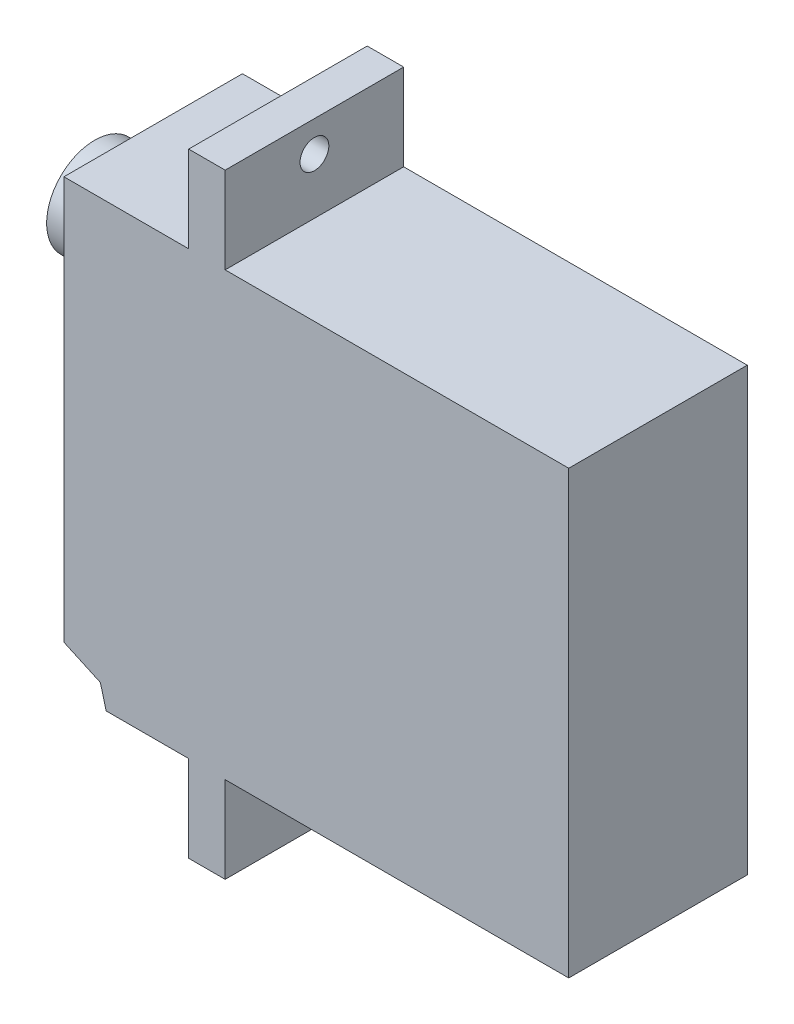
ISO-10303-21;
HEADER;
FILE_DESCRIPTION(('STEP AP214'),'2;1');
FILE_NAME('part.step','',(''),(''),'','','');
FILE_SCHEMA(('AUTOMOTIVE_DESIGN { 1 0 10303 214 1 1 1 1 }'));
ENDSEC;
DATA;
#1=APPLICATION_CONTEXT('core data for automotive mechanical design processes');
#2=APPLICATION_PROTOCOL_DEFINITION('international standard','automotive_design',2000,#1);
#3=PRODUCT_CONTEXT('',#1,'mechanical');
#4=PRODUCT('Part','Part','',(#3));
#5=PRODUCT_RELATED_PRODUCT_CATEGORY('part','',(#4));
#6=PRODUCT_DEFINITION_FORMATION('','',#4);
#7=PRODUCT_DEFINITION_CONTEXT('part definition',#1,'design');
#8=PRODUCT_DEFINITION('design','',#6,#7);
#9=PRODUCT_DEFINITION_SHAPE('','',#8);
#10=(LENGTH_UNIT() NAMED_UNIT(*) SI_UNIT(.MILLI.,.METRE.));
#11=(NAMED_UNIT(*) PLANE_ANGLE_UNIT() SI_UNIT($,.RADIAN.));
#12=(NAMED_UNIT(*) SI_UNIT($,.STERADIAN.) SOLID_ANGLE_UNIT());
#13=UNCERTAINTY_MEASURE_WITH_UNIT(LENGTH_MEASURE(1.E-05),#10,'distance_accuracy_value','');
#14=(GEOMETRIC_REPRESENTATION_CONTEXT(3) GLOBAL_UNCERTAINTY_ASSIGNED_CONTEXT((#13)) GLOBAL_UNIT_ASSIGNED_CONTEXT((#10,
#11,#12)) REPRESENTATION_CONTEXT('',''));
#15=CARTESIAN_POINT('',(0.,0.,0.));
#16=DIRECTION('',(0.,0.,1.));
#17=DIRECTION('',(1.,0.,0.));
#18=AXIS2_PLACEMENT_3D('',#15,#16,#17);
#19=CARTESIAN_POINT('',(-4.75000000000001,11.5,4.65));
#20=DIRECTION('',(0.,-1.,0.));
#21=DIRECTION('',(1.,0.,0.));
#22=AXIS2_PLACEMENT_3D('',#19,#20,#21);
#23=PLANE('',#22);
#24=DIRECTION('',(-1.,0.,0.));
#25=VECTOR('',#24,1.);
#26=CARTESIAN_POINT('',(-4.75000000000001,11.5,-4.65));
#27=LINE('',#26,#25);
#28=CARTESIAN_POINT('',(13.15,11.5,-4.65));
#29=VERTEX_POINT('',#28);
#30=CARTESIAN_POINT('',(-4.75000000000001,11.5,-4.65));
#31=VERTEX_POINT('',#30);
#32=EDGE_CURVE('E166',#29,#31,#27,.T.);
#33=ORIENTED_EDGE('',*,*,#32,.T.);
#34=DIRECTION('',(0.,0.,-1.));
#35=VECTOR('',#34,1.);
#36=CARTESIAN_POINT('',(-4.75000000000001,11.5,4.65));
#37=LINE('',#36,#35);
#38=CARTESIAN_POINT('',(-4.75000000000001,11.5,4.65));
#39=VERTEX_POINT('',#38);
#40=EDGE_CURVE('E11',#39,#31,#37,.T.);
#41=ORIENTED_EDGE('',*,*,#40,.F.);
#42=DIRECTION('',(-1.,0.,0.));
#43=VECTOR('',#42,1.);
#44=CARTESIAN_POINT('',(-4.75000000000001,11.5,4.65));
#45=LINE('',#44,#43);
#46=CARTESIAN_POINT('',(13.15,11.5,4.65));
#47=VERTEX_POINT('',#46);
#48=EDGE_CURVE('E192',#47,#39,#45,.T.);
#49=ORIENTED_EDGE('',*,*,#48,.F.);
#50=DIRECTION('',(0.,0.,-1.));
#51=VECTOR('',#50,1.);
#52=CARTESIAN_POINT('',(13.15,11.5,4.65));
#53=LINE('',#52,#51);
#54=EDGE_CURVE('E162',#47,#29,#53,.T.);
#55=ORIENTED_EDGE('',*,*,#54,.T.);
#56=EDGE_LOOP('',(#33,#41,#49,#55));
#57=FACE_BOUND('',#56,.T.);
#58=ADVANCED_FACE('F39',(#57),#23,.F.);
#59=CARTESIAN_POINT('',(-4.75000000000001,11.5,4.65));
#60=DIRECTION('',(-1.,0.,0.));
#61=DIRECTION('',(0.,0.,1.));
#62=AXIS2_PLACEMENT_3D('',#59,#60,#61);
#63=PLANE('',#62);
#64=CARTESIAN_POINT('',(-4.75000000000001,14.4,0.));
#65=DIRECTION('',(-1.,0.,0.));
#66=DIRECTION('',(0.,0.,1.));
#67=AXIS2_PLACEMENT_3D('',#64,#65,#66);
#68=CIRCLE('',#67,0.750000000000001);
#69=CARTESIAN_POINT('',(-4.75000000000001,14.4,0.750000000000001));
#70=VERTEX_POINT('',#69);
#71=EDGE_CURVE('E284',#70,#70,#68,.T.);
#72=ORIENTED_EDGE('',*,*,#71,.T.);
#73=EDGE_LOOP('',(#72));
#74=FACE_BOUND('',#73,.T.);
#75=DIRECTION('',(0.,1.,0.));
#76=VECTOR('',#75,1.);
#77=CARTESIAN_POINT('',(-4.75000000000001,11.5,-4.65));
#78=LINE('',#77,#76);
#79=CARTESIAN_POINT('',(-4.75000000000001,16.,-4.65));
#80=VERTEX_POINT('',#79);
#81=EDGE_CURVE('E169',#31,#80,#78,.T.);
#82=ORIENTED_EDGE('',*,*,#81,.T.);
#83=DIRECTION('',(0.,0.,-1.));
#84=VECTOR('',#83,1.);
#85=CARTESIAN_POINT('',(-4.75000000000001,16.,4.65));
#86=LINE('',#85,#84);
#87=CARTESIAN_POINT('',(-4.75000000000001,16.,4.65));
#88=VERTEX_POINT('',#87);
#89=EDGE_CURVE('E47',#88,#80,#86,.T.);
#90=ORIENTED_EDGE('',*,*,#89,.F.);
#91=DIRECTION('',(0.,1.,0.));
#92=VECTOR('',#91,1.);
#93=CARTESIAN_POINT('',(-4.75000000000001,11.5,4.65));
#94=LINE('',#93,#92);
#95=EDGE_CURVE('E113',#39,#88,#94,.T.);
#96=ORIENTED_EDGE('',*,*,#95,.F.);
#97=ORIENTED_EDGE('',*,*,#40,.T.);
#98=EDGE_LOOP('',(#82,#90,#96,#97));
#99=FACE_BOUND('',#98,.T.);
#100=ADVANCED_FACE('F314',(#74,#99),#63,.F.);
#101=CARTESIAN_POINT('',(-4.75000000000001,16.,4.65));
#102=DIRECTION('',(0.,-1.,0.));
#103=DIRECTION('',(1.,0.,0.));
#104=AXIS2_PLACEMENT_3D('',#101,#102,#103);
#105=PLANE('',#104);
#106=DIRECTION('',(-1.,0.,0.));
#107=VECTOR('',#106,1.);
#108=CARTESIAN_POINT('',(-4.75000000000001,16.,-4.65));
#109=LINE('',#108,#107);
#110=CARTESIAN_POINT('',(-6.65,16.,-4.65));
#111=VERTEX_POINT('',#110);
#112=EDGE_CURVE('E172',#80,#111,#109,.T.);
#113=ORIENTED_EDGE('',*,*,#112,.T.);
#114=DIRECTION('',(0.,0.,-1.));
#115=VECTOR('',#114,1.);
#116=CARTESIAN_POINT('',(-6.65,16.,4.65));
#117=LINE('',#116,#115);
#118=CARTESIAN_POINT('',(-6.65,16.,4.65));
#119=VERTEX_POINT('',#118);
#120=EDGE_CURVE('E208',#119,#111,#117,.T.);
#121=ORIENTED_EDGE('',*,*,#120,.F.);
#122=DIRECTION('',(-1.,0.,0.));
#123=VECTOR('',#122,1.);
#124=CARTESIAN_POINT('',(-4.75000000000001,16.,4.65));
#125=LINE('',#124,#123);
#126=EDGE_CURVE('E217',#88,#119,#125,.T.);
#127=ORIENTED_EDGE('',*,*,#126,.F.);
#128=ORIENTED_EDGE('',*,*,#89,.T.);
#129=EDGE_LOOP('',(#113,#121,#127,#128));
#130=FACE_BOUND('',#129,.T.);
#131=ADVANCED_FACE('F215',(#130),#105,.F.);
#132=CARTESIAN_POINT('',(-6.65,16.,4.65));
#133=DIRECTION('',(1.,0.,0.));
#134=DIRECTION('',(0.,1.,0.));
#135=AXIS2_PLACEMENT_3D('',#132,#133,#134);
#136=PLANE('',#135);
#137=CARTESIAN_POINT('',(-6.65,14.4,0.));
#138=DIRECTION('',(-1.,0.,0.));
#139=DIRECTION('',(0.,-1.,0.));
#140=AXIS2_PLACEMENT_3D('',#137,#138,#139);
#141=CIRCLE('',#140,0.750000000000001);
#142=CARTESIAN_POINT('',(-6.65,13.65,0.));
#143=VERTEX_POINT('',#142);
#144=EDGE_CURVE('E290',#143,#143,#141,.T.);
#145=ORIENTED_EDGE('',*,*,#144,.F.);
#146=EDGE_LOOP('',(#145));
#147=FACE_BOUND('',#146,.T.);
#148=DIRECTION('',(0.,-1.,0.));
#149=VECTOR('',#148,1.);
#150=CARTESIAN_POINT('',(-6.65,16.,-4.65));
#151=LINE('',#150,#149);
#152=CARTESIAN_POINT('',(-6.65,11.5,-4.65));
#153=VERTEX_POINT('',#152);
#154=EDGE_CURVE('E174',#111,#153,#151,.T.);
#155=ORIENTED_EDGE('',*,*,#154,.T.);
#156=DIRECTION('',(0.,0.,-1.));
#157=VECTOR('',#156,1.);
#158=CARTESIAN_POINT('',(-6.65,11.5,4.65));
#159=LINE('',#158,#157);
#160=CARTESIAN_POINT('',(-6.65,11.5,4.65));
#161=VERTEX_POINT('',#160);
#162=EDGE_CURVE('E205',#161,#153,#159,.T.);
#163=ORIENTED_EDGE('',*,*,#162,.F.);
#164=DIRECTION('',(0.,-1.,0.));
#165=VECTOR('',#164,1.);
#166=CARTESIAN_POINT('',(-6.65,16.,4.65));
#167=LINE('',#166,#165);
#168=EDGE_CURVE('E236',#119,#161,#167,.T.);
#169=ORIENTED_EDGE('',*,*,#168,.F.);
#170=ORIENTED_EDGE('',*,*,#120,.T.);
#171=EDGE_LOOP('',(#155,#163,#169,#170));
#172=FACE_BOUND('',#171,.T.);
#173=ADVANCED_FACE('F226',(#147,#172),#136,.F.);
#174=CARTESIAN_POINT('',(-13.15,11.5,4.65));
#175=DIRECTION('',(0.,-1.,0.));
#176=DIRECTION('',(0.,0.,-1.));
#177=AXIS2_PLACEMENT_3D('',#174,#175,#176);
#178=PLANE('',#177);
#179=DIRECTION('',(-1.,0.,0.));
#180=VECTOR('',#179,1.);
#181=CARTESIAN_POINT('',(-13.15,11.5,-4.65));
#182=LINE('',#181,#180);
#183=CARTESIAN_POINT('',(-13.15,11.5,-4.65));
#184=VERTEX_POINT('',#183);
#185=EDGE_CURVE('E176',#153,#184,#182,.T.);
#186=ORIENTED_EDGE('',*,*,#185,.T.);
#187=DIRECTION('',(0.,0.,-1.));
#188=VECTOR('',#187,1.);
#189=CARTESIAN_POINT('',(-13.15,11.5,4.65));
#190=LINE('',#189,#188);
#191=CARTESIAN_POINT('',(-13.15,11.5,4.65));
#192=VERTEX_POINT('',#191);
#193=EDGE_CURVE('E202',#192,#184,#190,.T.);
#194=ORIENTED_EDGE('',*,*,#193,.F.);
#195=DIRECTION('',(-1.,0.,0.));
#196=VECTOR('',#195,1.);
#197=CARTESIAN_POINT('',(-13.15,11.5,4.65));
#198=LINE('',#197,#196);
#199=EDGE_CURVE('E232',#161,#192,#198,.T.);
#200=ORIENTED_EDGE('',*,*,#199,.F.);
#201=ORIENTED_EDGE('',*,*,#162,.T.);
#202=EDGE_LOOP('',(#186,#194,#200,#201));
#203=FACE_BOUND('',#202,.T.);
#204=ADVANCED_FACE('F230',(#203),#178,.F.);
#205=CARTESIAN_POINT('',(-13.15,-11.5,4.65));
#206=DIRECTION('',(1.,0.,0.));
#207=DIRECTION('',(0.,0.,-1.));
#208=AXIS2_PLACEMENT_3D('',#205,#206,#207);
#209=PLANE('',#208);
#210=CARTESIAN_POINT('',(-13.15,6.8,0.));
#211=DIRECTION('',(1.,0.,0.));
#212=DIRECTION('',(0.,0.,-1.));
#213=AXIS2_PLACEMENT_3D('',#210,#211,#212);
#214=CIRCLE('',#213,2.5);
#215=CARTESIAN_POINT('',(-13.15,6.8,-2.5));
#216=VERTEX_POINT('',#215);
#217=EDGE_CURVE('E281',#216,#216,#214,.T.);
#218=ORIENTED_EDGE('',*,*,#217,.T.);
#219=EDGE_LOOP('',(#218));
#220=FACE_BOUND('',#219,.T.);
#221=DIRECTION('',(0.,-1.,0.));
#222=VECTOR('',#221,1.);
#223=CARTESIAN_POINT('',(-13.15,-11.5,-4.65));
#224=LINE('',#223,#222);
#225=CARTESIAN_POINT('',(-13.15,-9.5,-4.65));
#226=VERTEX_POINT('',#225);
#227=EDGE_CURVE('E179',#184,#226,#224,.T.);
#228=ORIENTED_EDGE('',*,*,#227,.T.);
#229=DIRECTION('',(0.,0.,1.));
#230=VECTOR('',#229,1.);
#231=CARTESIAN_POINT('',(-13.15,-9.5,-4.65));
#232=LINE('',#231,#230);
#233=CARTESIAN_POINT('',(-13.15,-9.5,4.65));
#234=VERTEX_POINT('',#233);
#235=EDGE_CURVE('E54',#226,#234,#232,.T.);
#236=ORIENTED_EDGE('',*,*,#235,.T.);
#237=DIRECTION('',(0.,-1.,0.));
#238=VECTOR('',#237,1.);
#239=CARTESIAN_POINT('',(-13.15,-9.5,4.65));
#240=LINE('',#239,#238);
#241=EDGE_CURVE('E235',#192,#234,#240,.T.);
#242=ORIENTED_EDGE('',*,*,#241,.F.);
#243=ORIENTED_EDGE('',*,*,#193,.T.);
#244=EDGE_LOOP('',(#228,#236,#242,#243));
#245=FACE_BOUND('',#244,.T.);
#246=ADVANCED_FACE('F329',(#220,#245),#209,.F.);
#247=CARTESIAN_POINT('',(-10.95,-11.5,4.65));
#248=DIRECTION('',(0.,1.,0.));
#249=DIRECTION('',(0.,0.,1.));
#250=AXIS2_PLACEMENT_3D('',#247,#248,#249);
#251=PLANE('',#250);
#252=DIRECTION('',(1.,0.,0.));
#253=VECTOR('',#252,1.);
#254=CARTESIAN_POINT('',(-10.95,-11.5,4.65));
#255=LINE('',#254,#253);
#256=CARTESIAN_POINT('',(-10.95,-11.5,4.65));
#257=VERTEX_POINT('',#256);
#258=CARTESIAN_POINT('',(-6.65,-11.5,4.65));
#259=VERTEX_POINT('',#258);
#260=EDGE_CURVE('E238',#257,#259,#255,.T.);
#261=ORIENTED_EDGE('',*,*,#260,.F.);
#262=DIRECTION('',(0.,0.,1.));
#263=VECTOR('',#262,1.);
#264=CARTESIAN_POINT('',(-10.95,-11.5,-4.65));
#265=LINE('',#264,#263);
#266=CARTESIAN_POINT('',(-10.95,-11.5,-4.65));
#267=VERTEX_POINT('',#266);
#268=EDGE_CURVE('E170',#267,#257,#265,.T.);
#269=ORIENTED_EDGE('',*,*,#268,.F.);
#270=DIRECTION('',(1.,0.,0.));
#271=VECTOR('',#270,1.);
#272=CARTESIAN_POINT('',(-10.95,-11.5,-4.65));
#273=LINE('',#272,#271);
#274=CARTESIAN_POINT('',(-6.65,-11.5,-4.65));
#275=VERTEX_POINT('',#274);
#276=EDGE_CURVE('E182',#267,#275,#273,.T.);
#277=ORIENTED_EDGE('',*,*,#276,.T.);
#278=DIRECTION('',(0.,0.,-1.));
#279=VECTOR('',#278,1.);
#280=CARTESIAN_POINT('',(-6.65,-11.5,4.65));
#281=LINE('',#280,#279);
#282=EDGE_CURVE('E199',#259,#275,#281,.T.);
#283=ORIENTED_EDGE('',*,*,#282,.F.);
#284=EDGE_LOOP('',(#261,#269,#277,#283));
#285=FACE_BOUND('',#284,.T.);
#286=ADVANCED_FACE('F332',(#285),#251,.F.);
#287=CARTESIAN_POINT('',(-6.65,-16.,4.65));
#288=DIRECTION('',(1.,0.,0.));
#289=DIRECTION('',(0.,0.,-1.));
#290=AXIS2_PLACEMENT_3D('',#287,#288,#289);
#291=PLANE('',#290);
#292=CARTESIAN_POINT('',(-6.65,-14.4,0.));
#293=DIRECTION('',(-1.,0.,0.));
#294=DIRECTION('',(0.,-1.,0.));
#295=AXIS2_PLACEMENT_3D('',#292,#293,#294);
#296=CIRCLE('',#295,0.750000000000001);
#297=CARTESIAN_POINT('',(-6.65,-15.15,0.));
#298=VERTEX_POINT('',#297);
#299=EDGE_CURVE('E287',#298,#298,#296,.T.);
#300=ORIENTED_EDGE('',*,*,#299,.F.);
#301=EDGE_LOOP('',(#300));
#302=FACE_BOUND('',#301,.T.);
#303=DIRECTION('',(0.,-1.,0.));
#304=VECTOR('',#303,1.);
#305=CARTESIAN_POINT('',(-6.65,-16.,-4.65));
#306=LINE('',#305,#304);
#307=CARTESIAN_POINT('',(-6.65,-16.,-4.65));
#308=VERTEX_POINT('',#307);
#309=EDGE_CURVE('E184',#275,#308,#306,.T.);
#310=ORIENTED_EDGE('',*,*,#309,.T.);
#311=DIRECTION('',(0.,0.,-1.));
#312=VECTOR('',#311,1.);
#313=CARTESIAN_POINT('',(-6.65,-16.,4.65));
#314=LINE('',#313,#312);
#315=CARTESIAN_POINT('',(-6.65,-16.,4.65));
#316=VERTEX_POINT('',#315);
#317=EDGE_CURVE('E196',#316,#308,#314,.T.);
#318=ORIENTED_EDGE('',*,*,#317,.F.);
#319=DIRECTION('',(0.,-1.,0.));
#320=VECTOR('',#319,1.);
#321=CARTESIAN_POINT('',(-6.65,-16.,4.65));
#322=LINE('',#321,#320);
#323=EDGE_CURVE('E244',#259,#316,#322,.T.);
#324=ORIENTED_EDGE('',*,*,#323,.F.);
#325=ORIENTED_EDGE('',*,*,#282,.T.);
#326=EDGE_LOOP('',(#310,#318,#324,#325));
#327=FACE_BOUND('',#326,.T.);
#328=ADVANCED_FACE('F250',(#302,#327),#291,.F.);
#329=CARTESIAN_POINT('',(-4.75000000000001,-16.,4.65));
#330=DIRECTION('',(0.,1.,0.));
#331=DIRECTION('',(-1.,0.,0.));
#332=AXIS2_PLACEMENT_3D('',#329,#330,#331);
#333=PLANE('',#332);
#334=DIRECTION('',(1.,0.,0.));
#335=VECTOR('',#334,1.);
#336=CARTESIAN_POINT('',(-4.75000000000001,-16.,-4.65));
#337=LINE('',#336,#335);
#338=CARTESIAN_POINT('',(-4.75000000000001,-16.,-4.65));
#339=VERTEX_POINT('',#338);
#340=EDGE_CURVE('E186',#308,#339,#337,.T.);
#341=ORIENTED_EDGE('',*,*,#340,.T.);
#342=DIRECTION('',(0.,0.,-1.));
#343=VECTOR('',#342,1.);
#344=CARTESIAN_POINT('',(-4.75000000000001,-16.,4.65));
#345=LINE('',#344,#343);
#346=CARTESIAN_POINT('',(-4.75000000000001,-16.,4.65));
#347=VERTEX_POINT('',#346);
#348=EDGE_CURVE('E157',#347,#339,#345,.T.);
#349=ORIENTED_EDGE('',*,*,#348,.F.);
#350=DIRECTION('',(1.,0.,0.));
#351=VECTOR('',#350,1.);
#352=CARTESIAN_POINT('',(-4.75000000000001,-16.,4.65));
#353=LINE('',#352,#351);
#354=EDGE_CURVE('E145',#316,#347,#353,.T.);
#355=ORIENTED_EDGE('',*,*,#354,.F.);
#356=ORIENTED_EDGE('',*,*,#317,.T.);
#357=EDGE_LOOP('',(#341,#349,#355,#356));
#358=FACE_BOUND('',#357,.T.);
#359=ADVANCED_FACE('F254',(#358),#333,.F.);
#360=CARTESIAN_POINT('',(-4.75000000000001,-11.5,4.65));
#361=DIRECTION('',(-1.,0.,0.));
#362=DIRECTION('',(0.,0.,1.));
#363=AXIS2_PLACEMENT_3D('',#360,#361,#362);
#364=PLANE('',#363);
#365=CARTESIAN_POINT('',(-4.75000000000001,-14.4,0.));
#366=DIRECTION('',(-1.,0.,0.));
#367=DIRECTION('',(0.,0.,1.));
#368=AXIS2_PLACEMENT_3D('',#365,#366,#367);
#369=CIRCLE('',#368,0.750000000000001);
#370=CARTESIAN_POINT('',(-4.75000000000001,-14.4,0.750000000000004));
#371=VERTEX_POINT('',#370);
#372=EDGE_CURVE('E42',#371,#371,#369,.T.);
#373=ORIENTED_EDGE('',*,*,#372,.T.);
#374=EDGE_LOOP('',(#373));
#375=FACE_BOUND('',#374,.T.);
#376=DIRECTION('',(0.,1.,0.));
#377=VECTOR('',#376,1.);
#378=CARTESIAN_POINT('',(-4.75000000000001,-11.5,-4.65));
#379=LINE('',#378,#377);
#380=CARTESIAN_POINT('',(-4.75000000000001,-11.5,-4.65));
#381=VERTEX_POINT('',#380);
#382=EDGE_CURVE('E154',#339,#381,#379,.T.);
#383=ORIENTED_EDGE('',*,*,#382,.T.);
#384=DIRECTION('',(0.,0.,-1.));
#385=VECTOR('',#384,1.);
#386=CARTESIAN_POINT('',(-4.75000000000001,-11.5,4.65));
#387=LINE('',#386,#385);
#388=CARTESIAN_POINT('',(-4.75000000000001,-11.5,4.65));
#389=VERTEX_POINT('',#388);
#390=EDGE_CURVE('E151',#389,#381,#387,.T.);
#391=ORIENTED_EDGE('',*,*,#390,.F.);
#392=DIRECTION('',(0.,1.,0.));
#393=VECTOR('',#392,1.);
#394=CARTESIAN_POINT('',(-4.75000000000001,-11.5,4.65));
#395=LINE('',#394,#393);
#396=EDGE_CURVE('E137',#347,#389,#395,.T.);
#397=ORIENTED_EDGE('',*,*,#396,.F.);
#398=ORIENTED_EDGE('',*,*,#348,.T.);
#399=EDGE_LOOP('',(#383,#391,#397,#398));
#400=FACE_BOUND('',#399,.T.);
#401=ADVANCED_FACE('F152',(#375,#400),#364,.F.);
#402=CARTESIAN_POINT('',(-4.75000000000001,-11.5,4.65));
#403=DIRECTION('',(0.,1.,0.));
#404=DIRECTION('',(-1.,0.,0.));
#405=AXIS2_PLACEMENT_3D('',#402,#403,#404);
#406=PLANE('',#405);
#407=DIRECTION('',(1.,0.,0.));
#408=VECTOR('',#407,1.);
#409=CARTESIAN_POINT('',(-4.75000000000001,-11.5,-4.65));
#410=LINE('',#409,#408);
#411=CARTESIAN_POINT('',(13.15,-11.5,-4.65));
#412=VERTEX_POINT('',#411);
#413=EDGE_CURVE('E189',#381,#412,#410,.T.);
#414=ORIENTED_EDGE('',*,*,#413,.T.);
#415=DIRECTION('',(0.,0.,-1.));
#416=VECTOR('',#415,1.);
#417=CARTESIAN_POINT('',(13.15,-11.5,4.65));
#418=LINE('',#417,#416);
#419=CARTESIAN_POINT('',(13.15,-11.5,4.65));
#420=VERTEX_POINT('',#419);
#421=EDGE_CURVE('E158',#420,#412,#418,.T.);
#422=ORIENTED_EDGE('',*,*,#421,.F.);
#423=DIRECTION('',(1.,0.,0.));
#424=VECTOR('',#423,1.);
#425=CARTESIAN_POINT('',(-4.75000000000001,-11.5,4.65));
#426=LINE('',#425,#424);
#427=EDGE_CURVE('E142',#389,#420,#426,.T.);
#428=ORIENTED_EDGE('',*,*,#427,.F.);
#429=ORIENTED_EDGE('',*,*,#390,.T.);
#430=EDGE_LOOP('',(#414,#422,#428,#429));
#431=FACE_BOUND('',#430,.T.);
#432=ADVANCED_FACE('F160',(#431),#406,.F.);
#433=CARTESIAN_POINT('',(13.15,-11.5,4.65));
#434=DIRECTION('',(-1.,0.,0.));
#435=DIRECTION('',(0.,0.,1.));
#436=AXIS2_PLACEMENT_3D('',#433,#434,#435);
#437=PLANE('',#436);
#438=DIRECTION('',(0.,1.,0.));
#439=VECTOR('',#438,1.);
#440=CARTESIAN_POINT('',(13.15,-11.5,-4.65));
#441=LINE('',#440,#439);
#442=EDGE_CURVE('E105',#412,#29,#441,.T.);
#443=ORIENTED_EDGE('',*,*,#442,.T.);
#444=ORIENTED_EDGE('',*,*,#54,.F.);
#445=DIRECTION('',(0.,1.,0.));
#446=VECTOR('',#445,1.);
#447=CARTESIAN_POINT('',(13.15,-11.5,4.65));
#448=LINE('',#447,#446);
#449=EDGE_CURVE('E63',#420,#47,#448,.T.);
#450=ORIENTED_EDGE('',*,*,#449,.F.);
#451=ORIENTED_EDGE('',*,*,#421,.T.);
#452=EDGE_LOOP('',(#443,#444,#450,#451));
#453=FACE_BOUND('',#452,.T.);
#454=ADVANCED_FACE('F255',(#453),#437,.F.);
#455=CARTESIAN_POINT('',(0.,0.,4.65));
#456=DIRECTION('',(0.,0.,1.));
#457=DIRECTION('',(1.,0.,0.));
#458=AXIS2_PLACEMENT_3D('',#455,#456,#457);
#459=PLANE('',#458);
#460=DIRECTION('',(-0.25691884950368,0.966432979967936,0.));
#461=VECTOR('',#460,1.);
#462=CARTESIAN_POINT('',(-10.95,-11.5,4.65));
#463=LINE('',#462,#461);
#464=CARTESIAN_POINT('',(-11.2512159717113,-10.3669377520674,4.65));
#465=VERTEX_POINT('',#464);
#466=EDGE_CURVE('E275',#257,#465,#463,.T.);
#467=ORIENTED_EDGE('',*,*,#466,.F.);
#468=ORIENTED_EDGE('',*,*,#260,.T.);
#469=ORIENTED_EDGE('',*,*,#323,.T.);
#470=ORIENTED_EDGE('',*,*,#354,.T.);
#471=ORIENTED_EDGE('',*,*,#396,.T.);
#472=ORIENTED_EDGE('',*,*,#427,.T.);
#473=ORIENTED_EDGE('',*,*,#449,.T.);
#474=ORIENTED_EDGE('',*,*,#48,.T.);
#475=ORIENTED_EDGE('',*,*,#95,.T.);
#476=ORIENTED_EDGE('',*,*,#126,.T.);
#477=ORIENTED_EDGE('',*,*,#168,.T.);
#478=ORIENTED_EDGE('',*,*,#199,.T.);
#479=ORIENTED_EDGE('',*,*,#241,.T.);
#480=DIRECTION('',(-0.909669620681649,0.415332615151886,0.));
#481=VECTOR('',#480,1.);
#482=CARTESIAN_POINT('',(-11.2512159717113,-10.3669377520674,4.65));
#483=LINE('',#482,#481);
#484=EDGE_CURVE('E273',#465,#234,#483,.T.);
#485=ORIENTED_EDGE('',*,*,#484,.F.);
#486=EDGE_LOOP('',(#467,#468,#469,#470,#471,#472,#473,#474,#475,#476,#477,#478,#479,#485));
#487=FACE_BOUND('',#486,.T.);
#488=ADVANCED_FACE('F140',(#487),#459,.T.);
#489=CARTESIAN_POINT('',(0.,0.,-4.65));
#490=DIRECTION('',(0.,0.,1.));
#491=DIRECTION('',(1.,0.,0.));
#492=AXIS2_PLACEMENT_3D('',#489,#490,#491);
#493=PLANE('',#492);
#494=ORIENTED_EDGE('',*,*,#276,.F.);
#495=DIRECTION('',(-0.25691884950368,0.966432979967936,0.));
#496=VECTOR('',#495,1.);
#497=CARTESIAN_POINT('',(-10.95,-11.5,-4.65));
#498=LINE('',#497,#496);
#499=CARTESIAN_POINT('',(-11.2512159717113,-10.3669377520674,-4.65));
#500=VERTEX_POINT('',#499);
#501=EDGE_CURVE('E270',#267,#500,#498,.T.);
#502=ORIENTED_EDGE('',*,*,#501,.T.);
#503=DIRECTION('',(-0.909669620681649,0.415332615151886,0.));
#504=VECTOR('',#503,1.);
#505=CARTESIAN_POINT('',(-11.2512159717113,-10.3669377520674,-4.65));
#506=LINE('',#505,#504);
#507=EDGE_CURVE('E265',#500,#226,#506,.T.);
#508=ORIENTED_EDGE('',*,*,#507,.T.);
#509=ORIENTED_EDGE('',*,*,#227,.F.);
#510=ORIENTED_EDGE('',*,*,#185,.F.);
#511=ORIENTED_EDGE('',*,*,#154,.F.);
#512=ORIENTED_EDGE('',*,*,#112,.F.);
#513=ORIENTED_EDGE('',*,*,#81,.F.);
#514=ORIENTED_EDGE('',*,*,#32,.F.);
#515=ORIENTED_EDGE('',*,*,#442,.F.);
#516=ORIENTED_EDGE('',*,*,#413,.F.);
#517=ORIENTED_EDGE('',*,*,#382,.F.);
#518=ORIENTED_EDGE('',*,*,#340,.F.);
#519=ORIENTED_EDGE('',*,*,#309,.F.);
#520=EDGE_LOOP('',(#494,#502,#508,#509,#510,#511,#512,#513,#514,#515,#516,#517,#518,#519));
#521=FACE_BOUND('',#520,.T.);
#522=ADVANCED_FACE('F221',(#521),#493,.F.);
#523=CARTESIAN_POINT('',(-10.95,-11.5,-4.65));
#524=DIRECTION('',(0.966432979967936,0.25691884950368,0.));
#525=DIRECTION('',(-0.25691884950368,0.966432979967936,0.));
#526=AXIS2_PLACEMENT_3D('',#523,#524,#525);
#527=PLANE('',#526);
#528=DIRECTION('',(0.,0.,1.));
#529=VECTOR('',#528,1.);
#530=CARTESIAN_POINT('',(-11.2512159717113,-10.3669377520674,-4.65));
#531=LINE('',#530,#529);
#532=EDGE_CURVE('E262',#500,#465,#531,.T.);
#533=ORIENTED_EDGE('',*,*,#532,.F.);
#534=ORIENTED_EDGE('',*,*,#501,.F.);
#535=ORIENTED_EDGE('',*,*,#268,.T.);
#536=ORIENTED_EDGE('',*,*,#466,.T.);
#537=EDGE_LOOP('',(#533,#534,#535,#536));
#538=FACE_BOUND('',#537,.T.);
#539=ADVANCED_FACE('F349',(#538),#527,.F.);
#540=CARTESIAN_POINT('',(-11.2512159717113,-10.3669377520674,-4.65));
#541=DIRECTION('',(0.415332615151886,0.909669620681649,0.));
#542=DIRECTION('',(-0.909669620681649,0.415332615151886,0.));
#543=AXIS2_PLACEMENT_3D('',#540,#541,#542);
#544=PLANE('',#543);
#545=ORIENTED_EDGE('',*,*,#235,.F.);
#546=ORIENTED_EDGE('',*,*,#507,.F.);
#547=ORIENTED_EDGE('',*,*,#532,.T.);
#548=ORIENTED_EDGE('',*,*,#484,.T.);
#549=EDGE_LOOP('',(#545,#546,#547,#548));
#550=FACE_BOUND('',#549,.T.);
#551=ADVANCED_FACE('F354',(#550),#544,.F.);
#552=CARTESIAN_POINT('',(-16.2,6.8,0.));
#553=DIRECTION('',(-1.,0.,0.));
#554=DIRECTION('',(0.,0.,1.));
#555=AXIS2_PLACEMENT_3D('',#552,#553,#554);
#556=PLANE('',#555);
#557=CARTESIAN_POINT('',(-16.2,6.8,0.));
#558=DIRECTION('',(1.,0.,0.));
#559=DIRECTION('',(0.,0.,-1.));
#560=AXIS2_PLACEMENT_3D('',#557,#558,#559);
#561=CIRCLE('',#560,2.5);
#562=CARTESIAN_POINT('',(-16.2,6.8,-2.5));
#563=VERTEX_POINT('',#562);
#564=EDGE_CURVE('E278',#563,#563,#561,.T.);
#565=ORIENTED_EDGE('',*,*,#564,.F.);
#566=EDGE_LOOP('',(#565));
#567=FACE_BOUND('',#566,.T.);
#568=ADVANCED_FACE('F310',(#567),#556,.T.);
#569=CARTESIAN_POINT('',(-13.15,6.8,0.));
#570=DIRECTION('',(1.,0.,0.));
#571=DIRECTION('',(0.,0.,-1.));
#572=AXIS2_PLACEMENT_3D('',#569,#570,#571);
#573=CYLINDRICAL_SURFACE('',#572,2.5);
#574=ORIENTED_EDGE('',*,*,#564,.T.);
#575=EDGE_LOOP('',(#574));
#576=FACE_BOUND('',#575,.T.);
#577=ORIENTED_EDGE('',*,*,#217,.F.);
#578=EDGE_LOOP('',(#577));
#579=FACE_BOUND('',#578,.T.);
#580=ADVANCED_FACE('F301',(#576,#579),#573,.T.);
#581=CARTESIAN_POINT('',(3.35,-14.4,0.));
#582=DIRECTION('',(-1.,0.,0.));
#583=DIRECTION('',(0.,-1.,0.));
#584=AXIS2_PLACEMENT_3D('',#581,#582,#583);
#585=CYLINDRICAL_SURFACE('',#584,0.750000000000001);
#586=ORIENTED_EDGE('',*,*,#299,.T.);
#587=EDGE_LOOP('',(#586));
#588=FACE_BOUND('',#587,.T.);
#589=ORIENTED_EDGE('',*,*,#372,.F.);
#590=EDGE_LOOP('',(#589));
#591=FACE_BOUND('',#590,.T.);
#592=ADVANCED_FACE('F298',(#588,#591),#585,.F.);
#593=CARTESIAN_POINT('',(3.35,14.4,0.));
#594=DIRECTION('',(-1.,0.,0.));
#595=DIRECTION('',(0.,-1.,0.));
#596=AXIS2_PLACEMENT_3D('',#593,#594,#595);
#597=CYLINDRICAL_SURFACE('',#596,0.750000000000001);
#598=ORIENTED_EDGE('',*,*,#144,.T.);
#599=EDGE_LOOP('',(#598));
#600=FACE_BOUND('',#599,.T.);
#601=ORIENTED_EDGE('',*,*,#71,.F.);
#602=EDGE_LOOP('',(#601));
#603=FACE_BOUND('',#602,.T.);
#604=ADVANCED_FACE('F300',(#600,#603),#597,.F.);
#605=CLOSED_SHELL('',(#58,#100,#131,#173,#204,#246,#286,#328,#359,#401,#432,#454,#488,#522,#539,
#551,#568,#580,#592,#604));
#606=MANIFOLD_SOLID_BREP('B2',#605);
#607=ADVANCED_BREP_SHAPE_REPRESENTATION('',(#18,#606),#14);
#608=SHAPE_DEFINITION_REPRESENTATION(#9,#607);
ENDSEC;
END-ISO-10303-21;
